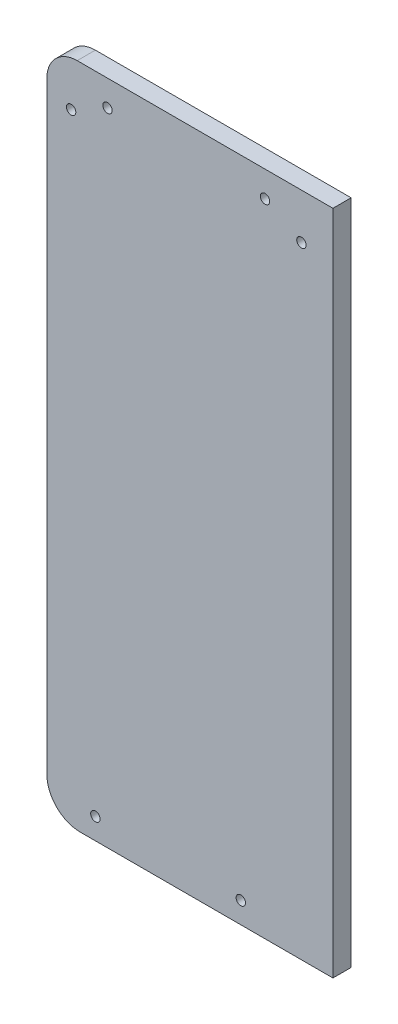
ISO-10303-21;
HEADER;
FILE_DESCRIPTION(('STEP AP214'),'2;1');
FILE_NAME('part.step','',(''),(''),'','','');
FILE_SCHEMA(('AUTOMOTIVE_DESIGN { 1 0 10303 214 1 1 1 1 }'));
ENDSEC;
DATA;
#1=APPLICATION_CONTEXT('core data for automotive mechanical design processes');
#2=APPLICATION_PROTOCOL_DEFINITION('international standard','automotive_design',2000,#1);
#3=PRODUCT_CONTEXT('',#1,'mechanical');
#4=PRODUCT('Part','Part','',(#3));
#5=PRODUCT_RELATED_PRODUCT_CATEGORY('part','',(#4));
#6=PRODUCT_DEFINITION_FORMATION('','',#4);
#7=PRODUCT_DEFINITION_CONTEXT('part definition',#1,'design');
#8=PRODUCT_DEFINITION('design','',#6,#7);
#9=PRODUCT_DEFINITION_SHAPE('','',#8);
#10=(LENGTH_UNIT() NAMED_UNIT(*) SI_UNIT(.MILLI.,.METRE.));
#11=(NAMED_UNIT(*) PLANE_ANGLE_UNIT() SI_UNIT($,.RADIAN.));
#12=(NAMED_UNIT(*) SI_UNIT($,.STERADIAN.) SOLID_ANGLE_UNIT());
#13=UNCERTAINTY_MEASURE_WITH_UNIT(LENGTH_MEASURE(1.E-05),#10,'distance_accuracy_value','');
#14=(GEOMETRIC_REPRESENTATION_CONTEXT(3) GLOBAL_UNCERTAINTY_ASSIGNED_CONTEXT((#13)) GLOBAL_UNIT_ASSIGNED_CONTEXT((#10,
#11,#12)) REPRESENTATION_CONTEXT('',''));
#15=CARTESIAN_POINT('',(0.,0.,0.));
#16=DIRECTION('',(0.,0.,1.));
#17=DIRECTION('',(1.,0.,0.));
#18=AXIS2_PLACEMENT_3D('',#15,#16,#17);
#19=CARTESIAN_POINT('',(-94.9999999999999,-176.603962955716,6.));
#20=DIRECTION('',(0.,0.,-1.));
#21=DIRECTION('',(-1.,0.,0.));
#22=AXIS2_PLACEMENT_3D('',#19,#20,#21);
#23=CYLINDRICAL_SURFACE('',#22,10.);
#24=CARTESIAN_POINT('',(-94.9999999999999,-176.603962955716,0.));
#25=DIRECTION('',(0.,0.,1.));
#26=DIRECTION('',(1.,0.,0.));
#27=AXIS2_PLACEMENT_3D('',#24,#25,#26);
#28=CIRCLE('',#27,10.);
#29=CARTESIAN_POINT('',(-94.9999999999999,-166.603962955716,0.));
#30=VERTEX_POINT('',#29);
#31=CARTESIAN_POINT('',(-105.,-176.603962955716,0.));
#32=VERTEX_POINT('',#31);
#33=EDGE_CURVE('E121',#30,#32,#28,.T.);
#34=ORIENTED_EDGE('',*,*,#33,.T.);
#35=DIRECTION('',(0.,0.,-1.));
#36=VECTOR('',#35,1.);
#37=CARTESIAN_POINT('',(-105.,-176.603962955716,6.));
#38=LINE('',#37,#36);
#39=CARTESIAN_POINT('',(-105.,-176.603962955716,6.));
#40=VERTEX_POINT('',#39);
#41=EDGE_CURVE('E11',#40,#32,#38,.T.);
#42=ORIENTED_EDGE('',*,*,#41,.F.);
#43=CARTESIAN_POINT('',(-94.9999999999999,-176.603962955716,6.));
#44=DIRECTION('',(0.,0.,1.));
#45=DIRECTION('',(1.,0.,0.));
#46=AXIS2_PLACEMENT_3D('',#43,#44,#45);
#47=CIRCLE('',#46,10.);
#48=CARTESIAN_POINT('',(-94.9999999999999,-166.603962955716,6.));
#49=VERTEX_POINT('',#48);
#50=EDGE_CURVE('E133',#49,#40,#47,.T.);
#51=ORIENTED_EDGE('',*,*,#50,.F.);
#52=DIRECTION('',(0.,0.,-1.));
#53=VECTOR('',#52,1.);
#54=CARTESIAN_POINT('',(-94.9999999999999,-166.603962955716,6.));
#55=LINE('',#54,#53);
#56=EDGE_CURVE('E117',#49,#30,#55,.T.);
#57=ORIENTED_EDGE('',*,*,#56,.T.);
#58=EDGE_LOOP('',(#34,#42,#51,#57));
#59=FACE_BOUND('',#58,.T.);
#60=ADVANCED_FACE('F37',(#59),#23,.T.);
#61=CARTESIAN_POINT('',(-105.,-375.603962955716,6.));
#62=DIRECTION('',(1.,0.,0.));
#63=DIRECTION('',(0.,1.,0.));
#64=AXIS2_PLACEMENT_3D('',#61,#62,#63);
#65=PLANE('',#64);
#66=DIRECTION('',(0.,-1.,0.));
#67=VECTOR('',#66,1.);
#68=CARTESIAN_POINT('',(-105.,-375.603962955716,0.));
#69=LINE('',#68,#67);
#70=CARTESIAN_POINT('',(-105.,-375.603962955716,0.));
#71=VERTEX_POINT('',#70);
#72=EDGE_CURVE('E124',#32,#71,#69,.T.);
#73=ORIENTED_EDGE('',*,*,#72,.T.);
#74=DIRECTION('',(0.,0.,-1.));
#75=VECTOR('',#74,1.);
#76=CARTESIAN_POINT('',(-105.,-375.603962955716,6.));
#77=LINE('',#76,#75);
#78=CARTESIAN_POINT('',(-105.,-375.603962955716,6.));
#79=VERTEX_POINT('',#78);
#80=EDGE_CURVE('E45',#79,#71,#77,.T.);
#81=ORIENTED_EDGE('',*,*,#80,.F.);
#82=DIRECTION('',(0.,-1.,0.));
#83=VECTOR('',#82,1.);
#84=CARTESIAN_POINT('',(-105.,-375.603962955716,6.));
#85=LINE('',#84,#83);
#86=EDGE_CURVE('E90',#40,#79,#85,.T.);
#87=ORIENTED_EDGE('',*,*,#86,.F.);
#88=ORIENTED_EDGE('',*,*,#41,.T.);
#89=EDGE_LOOP('',(#73,#81,#87,#88));
#90=FACE_BOUND('',#89,.T.);
#91=ADVANCED_FACE('F158',(#90),#65,.F.);
#92=CARTESIAN_POINT('',(-93.9999999999999,-375.603962955716,6.));
#93=DIRECTION('',(0.,0.,-1.));
#94=DIRECTION('',(-1.,0.,0.));
#95=AXIS2_PLACEMENT_3D('',#92,#93,#94);
#96=CYLINDRICAL_SURFACE('',#95,11.);
#97=CARTESIAN_POINT('',(-93.9999999999999,-375.603962955716,0.));
#98=DIRECTION('',(0.,0.,1.));
#99=DIRECTION('',(1.,0.,0.));
#100=AXIS2_PLACEMENT_3D('',#97,#98,#99);
#101=CIRCLE('',#100,11.);
#102=CARTESIAN_POINT('',(-93.9999999999999,-386.603962955716,0.));
#103=VERTEX_POINT('',#102);
#104=EDGE_CURVE('E128',#71,#103,#101,.T.);
#105=ORIENTED_EDGE('',*,*,#104,.T.);
#106=DIRECTION('',(0.,0.,-1.));
#107=VECTOR('',#106,1.);
#108=CARTESIAN_POINT('',(-93.9999999999999,-386.603962955716,6.));
#109=LINE('',#108,#107);
#110=CARTESIAN_POINT('',(-93.9999999999999,-386.603962955716,6.));
#111=VERTEX_POINT('',#110);
#112=EDGE_CURVE('E112',#111,#103,#109,.T.);
#113=ORIENTED_EDGE('',*,*,#112,.F.);
#114=CARTESIAN_POINT('',(-93.9999999999999,-375.603962955716,6.));
#115=DIRECTION('',(0.,0.,1.));
#116=DIRECTION('',(1.,0.,0.));
#117=AXIS2_PLACEMENT_3D('',#114,#115,#116);
#118=CIRCLE('',#117,11.);
#119=EDGE_CURVE('E103',#79,#111,#118,.T.);
#120=ORIENTED_EDGE('',*,*,#119,.F.);
#121=ORIENTED_EDGE('',*,*,#80,.T.);
#122=EDGE_LOOP('',(#105,#113,#120,#121));
#123=FACE_BOUND('',#122,.T.);
#124=ADVANCED_FACE('F139',(#123),#96,.T.);
#125=CARTESIAN_POINT('',(-10.5999999999975,-386.603962955716,6.));
#126=DIRECTION('',(0.,1.,0.));
#127=DIRECTION('',(0.,0.,1.));
#128=AXIS2_PLACEMENT_3D('',#125,#126,#127);
#129=PLANE('',#128);
#130=DIRECTION('',(1.,0.,0.));
#131=VECTOR('',#130,1.);
#132=CARTESIAN_POINT('',(-10.5999999999975,-386.603962955716,0.));
#133=LINE('',#132,#131);
#134=CARTESIAN_POINT('',(-10.5999999999975,-386.603962955716,0.));
#135=VERTEX_POINT('',#134);
#136=EDGE_CURVE('E111',#103,#135,#133,.T.);
#137=ORIENTED_EDGE('',*,*,#136,.T.);
#138=DIRECTION('',(0.,0.,-1.));
#139=VECTOR('',#138,1.);
#140=CARTESIAN_POINT('',(-10.5999999999975,-386.603962955716,6.));
#141=LINE('',#140,#139);
#142=CARTESIAN_POINT('',(-10.5999999999975,-386.603962955716,6.));
#143=VERTEX_POINT('',#142);
#144=EDGE_CURVE('E108',#143,#135,#141,.T.);
#145=ORIENTED_EDGE('',*,*,#144,.F.);
#146=DIRECTION('',(1.,0.,0.));
#147=VECTOR('',#146,1.);
#148=CARTESIAN_POINT('',(-10.5999999999975,-386.603962955716,6.));
#149=LINE('',#148,#147);
#150=EDGE_CURVE('E97',#111,#143,#149,.T.);
#151=ORIENTED_EDGE('',*,*,#150,.F.);
#152=ORIENTED_EDGE('',*,*,#112,.T.);
#153=EDGE_LOOP('',(#137,#145,#151,#152));
#154=FACE_BOUND('',#153,.T.);
#155=ADVANCED_FACE('F109',(#154),#129,.F.);
#156=CARTESIAN_POINT('',(-10.5999999999975,-166.603962955716,6.));
#157=DIRECTION('',(-1.,0.,0.));
#158=DIRECTION('',(0.,0.,1.));
#159=AXIS2_PLACEMENT_3D('',#156,#157,#158);
#160=PLANE('',#159);
#161=DIRECTION('',(0.,1.,0.));
#162=VECTOR('',#161,1.);
#163=CARTESIAN_POINT('',(-10.5999999999975,-166.603962955716,0.));
#164=LINE('',#163,#162);
#165=CARTESIAN_POINT('',(-10.5999999999975,-166.603962955716,0.));
#166=VERTEX_POINT('',#165);
#167=EDGE_CURVE('E76',#135,#166,#164,.T.);
#168=ORIENTED_EDGE('',*,*,#167,.T.);
#169=DIRECTION('',(0.,0.,-1.));
#170=VECTOR('',#169,1.);
#171=CARTESIAN_POINT('',(-10.5999999999975,-166.603962955716,6.));
#172=LINE('',#171,#170);
#173=CARTESIAN_POINT('',(-10.5999999999975,-166.603962955716,6.));
#174=VERTEX_POINT('',#173);
#175=EDGE_CURVE('E113',#174,#166,#172,.T.);
#176=ORIENTED_EDGE('',*,*,#175,.F.);
#177=DIRECTION('',(0.,1.,0.));
#178=VECTOR('',#177,1.);
#179=CARTESIAN_POINT('',(-10.5999999999975,-166.603962955716,6.));
#180=LINE('',#179,#178);
#181=EDGE_CURVE('E101',#143,#174,#180,.T.);
#182=ORIENTED_EDGE('',*,*,#181,.F.);
#183=ORIENTED_EDGE('',*,*,#144,.T.);
#184=EDGE_LOOP('',(#168,#176,#182,#183));
#185=FACE_BOUND('',#184,.T.);
#186=ADVANCED_FACE('F115',(#185),#160,.F.);
#187=CARTESIAN_POINT('',(-94.9999999999999,-166.603962955716,6.));
#188=DIRECTION('',(0.,-1.,0.));
#189=DIRECTION('',(0.,0.,-1.));
#190=AXIS2_PLACEMENT_3D('',#187,#188,#189);
#191=PLANE('',#190);
#192=DIRECTION('',(-1.,0.,0.));
#193=VECTOR('',#192,1.);
#194=CARTESIAN_POINT('',(-94.9999999999999,-166.603962955716,0.));
#195=LINE('',#194,#193);
#196=EDGE_CURVE('E82',#166,#30,#195,.T.);
#197=ORIENTED_EDGE('',*,*,#196,.T.);
#198=ORIENTED_EDGE('',*,*,#56,.F.);
#199=DIRECTION('',(-1.,0.,0.));
#200=VECTOR('',#199,1.);
#201=CARTESIAN_POINT('',(-94.9999999999999,-166.603962955716,6.));
#202=LINE('',#201,#200);
#203=EDGE_CURVE('E53',#174,#49,#202,.T.);
#204=ORIENTED_EDGE('',*,*,#203,.F.);
#205=ORIENTED_EDGE('',*,*,#175,.T.);
#206=EDGE_LOOP('',(#197,#198,#204,#205));
#207=FACE_BOUND('',#206,.T.);
#208=ADVANCED_FACE('F146',(#207),#191,.F.);
#209=CARTESIAN_POINT('',(-94.9999999999999,-176.603962955716,6.));
#210=DIRECTION('',(0.,0.,1.));
#211=DIRECTION('',(1.,0.,0.));
#212=AXIS2_PLACEMENT_3D('',#209,#210,#211);
#213=PLANE('',#212);
#214=CARTESIAN_POINT('',(-32.9999999999999,-175.103962955716,6.));
#215=DIRECTION('',(0.,0.,1.));
#216=DIRECTION('',(1.,0.,0.));
#217=AXIS2_PLACEMENT_3D('',#214,#215,#216);
#218=CIRCLE('',#217,1.55);
#219=CARTESIAN_POINT('',(-31.4499999999999,-175.103962955716,6.));
#220=VERTEX_POINT('',#219);
#221=EDGE_CURVE('E264',#220,#220,#218,.T.);
#222=ORIENTED_EDGE('',*,*,#221,.F.);
#223=EDGE_LOOP('',(#222));
#224=FACE_BOUND('',#223,.T.);
#225=CARTESIAN_POINT('',(-85.,-175.103962955716,6.));
#226=DIRECTION('',(0.,0.,1.));
#227=DIRECTION('',(1.,0.,0.));
#228=AXIS2_PLACEMENT_3D('',#225,#226,#227);
#229=CIRCLE('',#228,1.54999999999999);
#230=CARTESIAN_POINT('',(-83.45,-175.103962955716,6.));
#231=VERTEX_POINT('',#230);
#232=EDGE_CURVE('E266',#231,#231,#229,.T.);
#233=ORIENTED_EDGE('',*,*,#232,.F.);
#234=EDGE_LOOP('',(#233));
#235=FACE_BOUND('',#234,.T.);
#236=CARTESIAN_POINT('',(-97.,-181.603962955716,6.));
#237=DIRECTION('',(0.,0.,1.));
#238=DIRECTION('',(1.,0.,0.));
#239=AXIS2_PLACEMENT_3D('',#236,#237,#238);
#240=CIRCLE('',#239,1.54999999999994);
#241=CARTESIAN_POINT('',(-95.45,-181.603962955716,6.));
#242=VERTEX_POINT('',#241);
#243=EDGE_CURVE('E272',#242,#242,#240,.T.);
#244=ORIENTED_EDGE('',*,*,#243,.F.);
#245=EDGE_LOOP('',(#244));
#246=FACE_BOUND('',#245,.T.);
#247=CARTESIAN_POINT('',(-20.9999999999999,-181.603962955716,6.));
#248=DIRECTION('',(0.,0.,1.));
#249=DIRECTION('',(1.,0.,0.));
#250=AXIS2_PLACEMENT_3D('',#247,#248,#249);
#251=CIRCLE('',#250,1.54999999999994);
#252=CARTESIAN_POINT('',(-19.45,-181.603962955716,6.));
#253=VERTEX_POINT('',#252);
#254=EDGE_CURVE('E278',#253,#253,#251,.T.);
#255=ORIENTED_EDGE('',*,*,#254,.F.);
#256=EDGE_LOOP('',(#255));
#257=FACE_BOUND('',#256,.T.);
#258=CARTESIAN_POINT('',(-89.,-379.603962955716,6.));
#259=DIRECTION('',(0.,0.,1.));
#260=DIRECTION('',(1.,0.,0.));
#261=AXIS2_PLACEMENT_3D('',#258,#259,#260);
#262=CIRCLE('',#261,1.55);
#263=CARTESIAN_POINT('',(-87.45,-379.603962955716,6.));
#264=VERTEX_POINT('',#263);
#265=EDGE_CURVE('E284',#264,#264,#262,.T.);
#266=ORIENTED_EDGE('',*,*,#265,.F.);
#267=EDGE_LOOP('',(#266));
#268=FACE_BOUND('',#267,.T.);
#269=CARTESIAN_POINT('',(-40.9999999999999,-379.603962955716,6.));
#270=DIRECTION('',(0.,0.,1.));
#271=DIRECTION('',(1.,0.,0.));
#272=AXIS2_PLACEMENT_3D('',#269,#270,#271);
#273=CIRCLE('',#272,1.55000000000001);
#274=CARTESIAN_POINT('',(-39.4499999999999,-379.603962955716,6.));
#275=VERTEX_POINT('',#274);
#276=EDGE_CURVE('E290',#275,#275,#273,.T.);
#277=ORIENTED_EDGE('',*,*,#276,.F.);
#278=EDGE_LOOP('',(#277));
#279=FACE_BOUND('',#278,.T.);
#280=ORIENTED_EDGE('',*,*,#50,.T.);
#281=ORIENTED_EDGE('',*,*,#86,.T.);
#282=ORIENTED_EDGE('',*,*,#119,.T.);
#283=ORIENTED_EDGE('',*,*,#150,.T.);
#284=ORIENTED_EDGE('',*,*,#181,.T.);
#285=ORIENTED_EDGE('',*,*,#203,.T.);
#286=EDGE_LOOP('',(#280,#281,#282,#283,#284,#285));
#287=FACE_BOUND('',#286,.T.);
#288=ADVANCED_FACE('F99',(#224,#235,#246,#257,#268,#279,#287),#213,.T.);
#289=CARTESIAN_POINT('',(-94.9999999999999,-176.603962955716,0.));
#290=DIRECTION('',(0.,0.,1.));
#291=DIRECTION('',(1.,0.,0.));
#292=AXIS2_PLACEMENT_3D('',#289,#290,#291);
#293=PLANE('',#292);
#294=CARTESIAN_POINT('',(-32.9999999999999,-175.103962955716,0.));
#295=DIRECTION('',(0.,0.,1.));
#296=DIRECTION('',(1.,0.,0.));
#297=AXIS2_PLACEMENT_3D('',#294,#295,#296);
#298=CIRCLE('',#297,1.55);
#299=CARTESIAN_POINT('',(-31.4499999999999,-175.103962955716,0.));
#300=VERTEX_POINT('',#299);
#301=EDGE_CURVE('E261',#300,#300,#298,.T.);
#302=ORIENTED_EDGE('',*,*,#301,.T.);
#303=EDGE_LOOP('',(#302));
#304=FACE_BOUND('',#303,.T.);
#305=CARTESIAN_POINT('',(-85.,-175.103962955716,0.));
#306=DIRECTION('',(0.,0.,1.));
#307=DIRECTION('',(1.,0.,0.));
#308=AXIS2_PLACEMENT_3D('',#305,#306,#307);
#309=CIRCLE('',#308,1.54999999999999);
#310=CARTESIAN_POINT('',(-83.45,-175.103962955716,0.));
#311=VERTEX_POINT('',#310);
#312=EDGE_CURVE('E269',#311,#311,#309,.T.);
#313=ORIENTED_EDGE('',*,*,#312,.T.);
#314=EDGE_LOOP('',(#313));
#315=FACE_BOUND('',#314,.T.);
#316=CARTESIAN_POINT('',(-97.,-181.603962955716,0.));
#317=DIRECTION('',(0.,0.,1.));
#318=DIRECTION('',(1.,0.,0.));
#319=AXIS2_PLACEMENT_3D('',#316,#317,#318);
#320=CIRCLE('',#319,1.54999999999994);
#321=CARTESIAN_POINT('',(-95.45,-181.603962955716,0.));
#322=VERTEX_POINT('',#321);
#323=EDGE_CURVE('E275',#322,#322,#320,.T.);
#324=ORIENTED_EDGE('',*,*,#323,.T.);
#325=EDGE_LOOP('',(#324));
#326=FACE_BOUND('',#325,.T.);
#327=CARTESIAN_POINT('',(-20.9999999999999,-181.603962955716,0.));
#328=DIRECTION('',(0.,0.,1.));
#329=DIRECTION('',(1.,0.,0.));
#330=AXIS2_PLACEMENT_3D('',#327,#328,#329);
#331=CIRCLE('',#330,1.54999999999994);
#332=CARTESIAN_POINT('',(-19.45,-181.603962955716,0.));
#333=VERTEX_POINT('',#332);
#334=EDGE_CURVE('E281',#333,#333,#331,.T.);
#335=ORIENTED_EDGE('',*,*,#334,.T.);
#336=EDGE_LOOP('',(#335));
#337=FACE_BOUND('',#336,.T.);
#338=CARTESIAN_POINT('',(-89.,-379.603962955716,0.));
#339=DIRECTION('',(0.,0.,1.));
#340=DIRECTION('',(1.,0.,0.));
#341=AXIS2_PLACEMENT_3D('',#338,#339,#340);
#342=CIRCLE('',#341,1.55);
#343=CARTESIAN_POINT('',(-87.45,-379.603962955716,0.));
#344=VERTEX_POINT('',#343);
#345=EDGE_CURVE('E287',#344,#344,#342,.T.);
#346=ORIENTED_EDGE('',*,*,#345,.T.);
#347=EDGE_LOOP('',(#346));
#348=FACE_BOUND('',#347,.T.);
#349=CARTESIAN_POINT('',(-40.9999999999999,-379.603962955716,0.));
#350=DIRECTION('',(0.,0.,1.));
#351=DIRECTION('',(1.,0.,0.));
#352=AXIS2_PLACEMENT_3D('',#349,#350,#351);
#353=CIRCLE('',#352,1.55000000000001);
#354=CARTESIAN_POINT('',(-39.4499999999999,-379.603962955716,0.));
#355=VERTEX_POINT('',#354);
#356=EDGE_CURVE('E125',#355,#355,#353,.T.);
#357=ORIENTED_EDGE('',*,*,#356,.T.);
#358=EDGE_LOOP('',(#357));
#359=FACE_BOUND('',#358,.T.);
#360=ORIENTED_EDGE('',*,*,#33,.F.);
#361=ORIENTED_EDGE('',*,*,#196,.F.);
#362=ORIENTED_EDGE('',*,*,#167,.F.);
#363=ORIENTED_EDGE('',*,*,#136,.F.);
#364=ORIENTED_EDGE('',*,*,#104,.F.);
#365=ORIENTED_EDGE('',*,*,#72,.F.);
#366=EDGE_LOOP('',(#360,#361,#362,#363,#364,#365));
#367=FACE_BOUND('',#366,.T.);
#368=ADVANCED_FACE('F142',(#304,#315,#326,#337,#348,#359,#367),#293,.F.);
#369=CARTESIAN_POINT('',(-40.9999999999999,-379.603962955716,0.));
#370=DIRECTION('',(0.,0.,1.));
#371=DIRECTION('',(1.,0.,0.));
#372=AXIS2_PLACEMENT_3D('',#369,#370,#371);
#373=CYLINDRICAL_SURFACE('',#372,1.55000000000001);
#374=ORIENTED_EDGE('',*,*,#356,.F.);
#375=EDGE_LOOP('',(#374));
#376=FACE_BOUND('',#375,.T.);
#377=ORIENTED_EDGE('',*,*,#276,.T.);
#378=EDGE_LOOP('',(#377));
#379=FACE_BOUND('',#378,.T.);
#380=ADVANCED_FACE('F186',(#376,#379),#373,.F.);
#381=CARTESIAN_POINT('',(-89.,-379.603962955716,0.));
#382=DIRECTION('',(0.,0.,1.));
#383=DIRECTION('',(1.,0.,0.));
#384=AXIS2_PLACEMENT_3D('',#381,#382,#383);
#385=CYLINDRICAL_SURFACE('',#384,1.55);
#386=ORIENTED_EDGE('',*,*,#345,.F.);
#387=EDGE_LOOP('',(#386));
#388=FACE_BOUND('',#387,.T.);
#389=ORIENTED_EDGE('',*,*,#265,.T.);
#390=EDGE_LOOP('',(#389));
#391=FACE_BOUND('',#390,.T.);
#392=ADVANCED_FACE('F191',(#388,#391),#385,.F.);
#393=CARTESIAN_POINT('',(-20.9999999999999,-181.603962955716,0.));
#394=DIRECTION('',(0.,0.,1.));
#395=DIRECTION('',(1.,0.,0.));
#396=AXIS2_PLACEMENT_3D('',#393,#394,#395);
#397=CYLINDRICAL_SURFACE('',#396,1.54999999999994);
#398=ORIENTED_EDGE('',*,*,#334,.F.);
#399=EDGE_LOOP('',(#398));
#400=FACE_BOUND('',#399,.T.);
#401=ORIENTED_EDGE('',*,*,#254,.T.);
#402=EDGE_LOOP('',(#401));
#403=FACE_BOUND('',#402,.T.);
#404=ADVANCED_FACE('F203',(#400,#403),#397,.F.);
#405=CARTESIAN_POINT('',(-97.,-181.603962955716,0.));
#406=DIRECTION('',(0.,0.,1.));
#407=DIRECTION('',(1.,0.,0.));
#408=AXIS2_PLACEMENT_3D('',#405,#406,#407);
#409=CYLINDRICAL_SURFACE('',#408,1.54999999999994);
#410=ORIENTED_EDGE('',*,*,#323,.F.);
#411=EDGE_LOOP('',(#410));
#412=FACE_BOUND('',#411,.T.);
#413=ORIENTED_EDGE('',*,*,#243,.T.);
#414=EDGE_LOOP('',(#413));
#415=FACE_BOUND('',#414,.T.);
#416=ADVANCED_FACE('F224',(#412,#415),#409,.F.);
#417=CARTESIAN_POINT('',(-85.,-175.103962955716,0.));
#418=DIRECTION('',(0.,0.,1.));
#419=DIRECTION('',(1.,0.,0.));
#420=AXIS2_PLACEMENT_3D('',#417,#418,#419);
#421=CYLINDRICAL_SURFACE('',#420,1.54999999999999);
#422=ORIENTED_EDGE('',*,*,#312,.F.);
#423=EDGE_LOOP('',(#422));
#424=FACE_BOUND('',#423,.T.);
#425=ORIENTED_EDGE('',*,*,#232,.T.);
#426=EDGE_LOOP('',(#425));
#427=FACE_BOUND('',#426,.T.);
#428=ADVANCED_FACE('F234',(#424,#427),#421,.F.);
#429=CARTESIAN_POINT('',(-32.9999999999999,-175.103962955716,0.));
#430=DIRECTION('',(0.,0.,1.));
#431=DIRECTION('',(1.,0.,0.));
#432=AXIS2_PLACEMENT_3D('',#429,#430,#431);
#433=CYLINDRICAL_SURFACE('',#432,1.55);
#434=ORIENTED_EDGE('',*,*,#301,.F.);
#435=EDGE_LOOP('',(#434));
#436=FACE_BOUND('',#435,.T.);
#437=ORIENTED_EDGE('',*,*,#221,.T.);
#438=EDGE_LOOP('',(#437));
#439=FACE_BOUND('',#438,.T.);
#440=ADVANCED_FACE('F244',(#436,#439),#433,.F.);
#441=CLOSED_SHELL('',(#60,#91,#124,#155,#186,#208,#288,#368,#380,#392,#404,#416,#428,#440));
#442=MANIFOLD_SOLID_BREP('B2',#441);
#443=ADVANCED_BREP_SHAPE_REPRESENTATION('',(#18,#442),#14);
#444=SHAPE_DEFINITION_REPRESENTATION(#9,#443);
ENDSEC;
END-ISO-10303-21;
